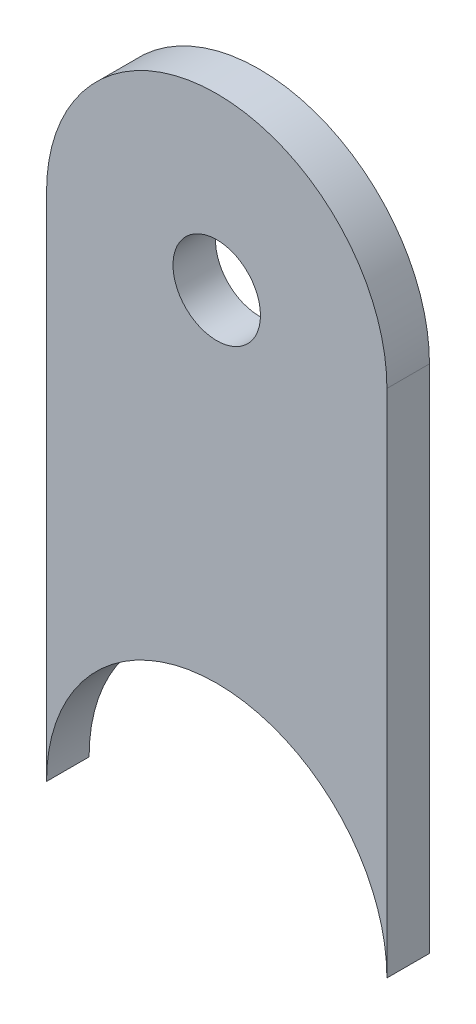
ISO-10303-21;
HEADER;
FILE_DESCRIPTION(('STEP AP214'),'2;1');
FILE_NAME('part.step','',(''),(''),'','','');
FILE_SCHEMA(('AUTOMOTIVE_DESIGN { 1 0 10303 214 1 1 1 1 }'));
ENDSEC;
DATA;
#1=APPLICATION_CONTEXT('core data for automotive mechanical design processes');
#2=APPLICATION_PROTOCOL_DEFINITION('international standard','automotive_design',2000,#1);
#3=PRODUCT_CONTEXT('',#1,'mechanical');
#4=PRODUCT('Part','Part','',(#3));
#5=PRODUCT_RELATED_PRODUCT_CATEGORY('part','',(#4));
#6=PRODUCT_DEFINITION_FORMATION('','',#4);
#7=PRODUCT_DEFINITION_CONTEXT('part definition',#1,'design');
#8=PRODUCT_DEFINITION('design','',#6,#7);
#9=PRODUCT_DEFINITION_SHAPE('','',#8);
#10=(LENGTH_UNIT() NAMED_UNIT(*) SI_UNIT(.MILLI.,.METRE.));
#11=(NAMED_UNIT(*) PLANE_ANGLE_UNIT() SI_UNIT($,.RADIAN.));
#12=(NAMED_UNIT(*) SI_UNIT($,.STERADIAN.) SOLID_ANGLE_UNIT());
#13=UNCERTAINTY_MEASURE_WITH_UNIT(LENGTH_MEASURE(1.E-05),#10,'distance_accuracy_value','');
#14=(GEOMETRIC_REPRESENTATION_CONTEXT(3) GLOBAL_UNCERTAINTY_ASSIGNED_CONTEXT((#13)) GLOBAL_UNIT_ASSIGNED_CONTEXT((#10,
#11,#12)) REPRESENTATION_CONTEXT('',''));
#15=CARTESIAN_POINT('',(0.,0.,0.));
#16=DIRECTION('',(0.,0.,1.));
#17=DIRECTION('',(1.,0.,0.));
#18=AXIS2_PLACEMENT_3D('',#15,#16,#17);
#19=CARTESIAN_POINT('',(0.,0.,3.175));
#20=DIRECTION('',(-1.,0.,0.));
#21=DIRECTION('',(0.,-1.,0.));
#22=AXIS2_PLACEMENT_3D('',#19,#20,#21);
#23=PLANE('',#22);
#24=DIRECTION('',(0.,1.,0.));
#25=VECTOR('',#24,1.);
#26=CARTESIAN_POINT('',(0.,0.,0.));
#27=LINE('',#26,#25);
#28=CARTESIAN_POINT('',(0.,0.,0.));
#29=VERTEX_POINT('',#28);
#30=CARTESIAN_POINT('',(0.,38.1,0.));
#31=VERTEX_POINT('',#30);
#32=EDGE_CURVE('E111',#29,#31,#27,.T.);
#33=ORIENTED_EDGE('',*,*,#32,.F.);
#34=DIRECTION('',(0.,0.,-1.));
#35=VECTOR('',#34,1.);
#36=CARTESIAN_POINT('',(0.,0.,3.175));
#37=LINE('',#36,#35);
#38=CARTESIAN_POINT('',(0.,0.,3.175));
#39=VERTEX_POINT('',#38);
#40=EDGE_CURVE('E11',#39,#29,#37,.T.);
#41=ORIENTED_EDGE('',*,*,#40,.F.);
#42=DIRECTION('',(0.,1.,0.));
#43=VECTOR('',#42,1.);
#44=CARTESIAN_POINT('',(0.,0.,3.175));
#45=LINE('',#44,#43);
#46=CARTESIAN_POINT('',(0.,38.1,3.175));
#47=VERTEX_POINT('',#46);
#48=EDGE_CURVE('E102',#39,#47,#45,.T.);
#49=ORIENTED_EDGE('',*,*,#48,.T.);
#50=DIRECTION('',(0.,0.,-1.));
#51=VECTOR('',#50,1.);
#52=CARTESIAN_POINT('',(0.,38.1,3.175));
#53=LINE('',#52,#51);
#54=EDGE_CURVE('E59',#47,#31,#53,.T.);
#55=ORIENTED_EDGE('',*,*,#54,.T.);
#56=EDGE_LOOP('',(#33,#41,#49,#55));
#57=FACE_BOUND('',#56,.T.);
#58=ADVANCED_FACE('F43',(#57),#23,.T.);
#59=CARTESIAN_POINT('',(12.7,0.,3.175));
#60=DIRECTION('',(0.,0.,-1.));
#61=DIRECTION('',(-1.,0.,0.));
#62=AXIS2_PLACEMENT_3D('',#59,#60,#61);
#63=CYLINDRICAL_SURFACE('',#62,12.7);
#64=CARTESIAN_POINT('',(12.7,0.,0.));
#65=DIRECTION('',(0.,0.,1.));
#66=DIRECTION('',(1.,0.,0.));
#67=AXIS2_PLACEMENT_3D('',#64,#65,#66);
#68=CIRCLE('',#67,12.7);
#69=CARTESIAN_POINT('',(25.4,0.,0.));
#70=VERTEX_POINT('',#69);
#71=EDGE_CURVE('E91',#70,#29,#68,.T.);
#72=ORIENTED_EDGE('',*,*,#71,.F.);
#73=DIRECTION('',(0.,0.,-1.));
#74=VECTOR('',#73,1.);
#75=CARTESIAN_POINT('',(25.4,0.,3.175));
#76=LINE('',#75,#74);
#77=CARTESIAN_POINT('',(25.4,0.,3.175));
#78=VERTEX_POINT('',#77);
#79=EDGE_CURVE('E51',#78,#70,#76,.T.);
#80=ORIENTED_EDGE('',*,*,#79,.F.);
#81=CARTESIAN_POINT('',(12.7,0.,3.175));
#82=DIRECTION('',(0.,0.,1.));
#83=DIRECTION('',(1.,0.,0.));
#84=AXIS2_PLACEMENT_3D('',#81,#82,#83);
#85=CIRCLE('',#84,12.7);
#86=EDGE_CURVE('E89',#78,#39,#85,.T.);
#87=ORIENTED_EDGE('',*,*,#86,.T.);
#88=ORIENTED_EDGE('',*,*,#40,.T.);
#89=EDGE_LOOP('',(#72,#80,#87,#88));
#90=FACE_BOUND('',#89,.T.);
#91=ADVANCED_FACE('F87',(#90),#63,.F.);
#92=CARTESIAN_POINT('',(25.4,0.,3.175));
#93=DIRECTION('',(-1.,0.,0.));
#94=DIRECTION('',(0.,-1.,0.));
#95=AXIS2_PLACEMENT_3D('',#92,#93,#94);
#96=PLANE('',#95);
#97=DIRECTION('',(0.,1.,0.));
#98=VECTOR('',#97,1.);
#99=CARTESIAN_POINT('',(25.4,0.,0.));
#100=LINE('',#99,#98);
#101=CARTESIAN_POINT('',(25.4,38.1,0.));
#102=VERTEX_POINT('',#101);
#103=EDGE_CURVE('E114',#70,#102,#100,.T.);
#104=ORIENTED_EDGE('',*,*,#103,.T.);
#105=DIRECTION('',(0.,0.,-1.));
#106=VECTOR('',#105,1.);
#107=CARTESIAN_POINT('',(25.4,38.1,3.175));
#108=LINE('',#107,#106);
#109=CARTESIAN_POINT('',(25.4,38.1,3.175));
#110=VERTEX_POINT('',#109);
#111=EDGE_CURVE('E73',#110,#102,#108,.T.);
#112=ORIENTED_EDGE('',*,*,#111,.F.);
#113=DIRECTION('',(0.,1.,0.));
#114=VECTOR('',#113,1.);
#115=CARTESIAN_POINT('',(25.4,0.,3.175));
#116=LINE('',#115,#114);
#117=EDGE_CURVE('E94',#78,#110,#116,.T.);
#118=ORIENTED_EDGE('',*,*,#117,.F.);
#119=ORIENTED_EDGE('',*,*,#79,.T.);
#120=EDGE_LOOP('',(#104,#112,#118,#119));
#121=FACE_BOUND('',#120,.T.);
#122=ADVANCED_FACE('F95',(#121),#96,.F.);
#123=CARTESIAN_POINT('',(12.7,38.1,3.175));
#124=DIRECTION('',(0.,0.,-1.));
#125=DIRECTION('',(-1.,0.,0.));
#126=AXIS2_PLACEMENT_3D('',#123,#124,#125);
#127=CYLINDRICAL_SURFACE('',#126,12.7);
#128=CARTESIAN_POINT('',(12.7,38.1,0.));
#129=DIRECTION('',(0.,0.,1.));
#130=DIRECTION('',(1.,0.,0.));
#131=AXIS2_PLACEMENT_3D('',#128,#129,#130);
#132=CIRCLE('',#131,12.7);
#133=EDGE_CURVE('E116',#31,#102,#132,.F.);
#134=ORIENTED_EDGE('',*,*,#133,.F.);
#135=ORIENTED_EDGE('',*,*,#54,.F.);
#136=CARTESIAN_POINT('',(12.7,38.1,3.175));
#137=DIRECTION('',(0.,0.,1.));
#138=DIRECTION('',(1.,0.,0.));
#139=AXIS2_PLACEMENT_3D('',#136,#137,#138);
#140=CIRCLE('',#139,12.7);
#141=EDGE_CURVE('E98',#47,#110,#140,.F.);
#142=ORIENTED_EDGE('',*,*,#141,.T.);
#143=ORIENTED_EDGE('',*,*,#111,.T.);
#144=EDGE_LOOP('',(#134,#135,#142,#143));
#145=FACE_BOUND('',#144,.T.);
#146=ADVANCED_FACE('F128',(#145),#127,.T.);
#147=CARTESIAN_POINT('',(12.7,38.1,3.175));
#148=DIRECTION('',(0.,0.,-1.));
#149=DIRECTION('',(-1.,0.,0.));
#150=AXIS2_PLACEMENT_3D('',#147,#148,#149);
#151=CYLINDRICAL_SURFACE('',#150,3.2639);
#152=CARTESIAN_POINT('',(12.7,38.1,3.175));
#153=DIRECTION('',(0.,0.,1.));
#154=DIRECTION('',(1.,0.,0.));
#155=AXIS2_PLACEMENT_3D('',#152,#153,#154);
#156=CIRCLE('',#155,3.2639);
#157=CARTESIAN_POINT('',(15.9639,38.1,3.175));
#158=VERTEX_POINT('',#157);
#159=EDGE_CURVE('E108',#158,#158,#156,.T.);
#160=ORIENTED_EDGE('',*,*,#159,.T.);
#161=EDGE_LOOP('',(#160));
#162=FACE_BOUND('',#161,.T.);
#163=CARTESIAN_POINT('',(12.7,38.1,0.));
#164=DIRECTION('',(0.,0.,1.));
#165=DIRECTION('',(1.,0.,0.));
#166=AXIS2_PLACEMENT_3D('',#163,#164,#165);
#167=CIRCLE('',#166,3.2639);
#168=CARTESIAN_POINT('',(15.9639,38.1,0.));
#169=VERTEX_POINT('',#168);
#170=EDGE_CURVE('E104',#169,#169,#167,.T.);
#171=ORIENTED_EDGE('',*,*,#170,.F.);
#172=EDGE_LOOP('',(#171));
#173=FACE_BOUND('',#172,.T.);
#174=ADVANCED_FACE('F126',(#162,#173),#151,.F.);
#175=CARTESIAN_POINT('',(0.,0.,3.175));
#176=DIRECTION('',(0.,0.,1.));
#177=DIRECTION('',(1.,0.,0.));
#178=AXIS2_PLACEMENT_3D('',#175,#176,#177);
#179=PLANE('',#178);
#180=ORIENTED_EDGE('',*,*,#48,.F.);
#181=ORIENTED_EDGE('',*,*,#86,.F.);
#182=ORIENTED_EDGE('',*,*,#117,.T.);
#183=ORIENTED_EDGE('',*,*,#141,.F.);
#184=EDGE_LOOP('',(#180,#181,#182,#183));
#185=FACE_BOUND('',#184,.T.);
#186=ORIENTED_EDGE('',*,*,#159,.F.);
#187=EDGE_LOOP('',(#186));
#188=FACE_BOUND('',#187,.T.);
#189=ADVANCED_FACE('F100',(#185,#188),#179,.T.);
#190=CARTESIAN_POINT('',(0.,0.,0.));
#191=DIRECTION('',(0.,0.,1.));
#192=DIRECTION('',(1.,0.,0.));
#193=AXIS2_PLACEMENT_3D('',#190,#191,#192);
#194=PLANE('',#193);
#195=ORIENTED_EDGE('',*,*,#32,.T.);
#196=ORIENTED_EDGE('',*,*,#133,.T.);
#197=ORIENTED_EDGE('',*,*,#103,.F.);
#198=ORIENTED_EDGE('',*,*,#71,.T.);
#199=EDGE_LOOP('',(#195,#196,#197,#198));
#200=FACE_BOUND('',#199,.T.);
#201=ORIENTED_EDGE('',*,*,#170,.T.);
#202=EDGE_LOOP('',(#201));
#203=FACE_BOUND('',#202,.T.);
#204=ADVANCED_FACE('F124',(#200,#203),#194,.F.);
#205=CLOSED_SHELL('',(#58,#91,#122,#146,#174,#189,#204));
#206=MANIFOLD_SOLID_BREP('B2',#205);
#207=ADVANCED_BREP_SHAPE_REPRESENTATION('',(#18,#206),#14);
#208=SHAPE_DEFINITION_REPRESENTATION(#9,#207);
ENDSEC;
END-ISO-10303-21;
